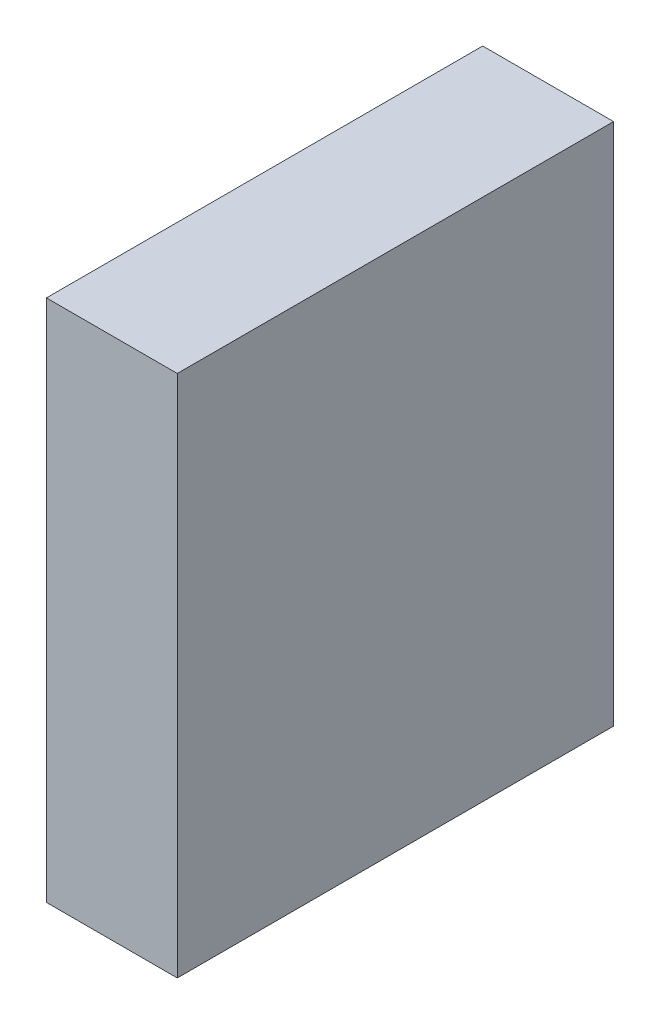
ISO-10303-21;
HEADER;
FILE_DESCRIPTION(('STEP AP214'),'2;1');
FILE_NAME('part.step','',(''),(''),'','','');
FILE_SCHEMA(('AUTOMOTIVE_DESIGN { 1 0 10303 214 1 1 1 1 }'));
ENDSEC;
DATA;
#1=APPLICATION_CONTEXT('core data for automotive mechanical design processes');
#2=APPLICATION_PROTOCOL_DEFINITION('international standard','automotive_design',2000,#1);
#3=PRODUCT_CONTEXT('',#1,'mechanical');
#4=PRODUCT('Part','Part','',(#3));
#5=PRODUCT_RELATED_PRODUCT_CATEGORY('part','',(#4));
#6=PRODUCT_DEFINITION_FORMATION('','',#4);
#7=PRODUCT_DEFINITION_CONTEXT('part definition',#1,'design');
#8=PRODUCT_DEFINITION('design','',#6,#7);
#9=PRODUCT_DEFINITION_SHAPE('','',#8);
#10=(LENGTH_UNIT() NAMED_UNIT(*) SI_UNIT(.MILLI.,.METRE.));
#11=(NAMED_UNIT(*) PLANE_ANGLE_UNIT() SI_UNIT($,.RADIAN.));
#12=(NAMED_UNIT(*) SI_UNIT($,.STERADIAN.) SOLID_ANGLE_UNIT());
#13=UNCERTAINTY_MEASURE_WITH_UNIT(LENGTH_MEASURE(1.E-05),#10,'distance_accuracy_value','');
#14=(GEOMETRIC_REPRESENTATION_CONTEXT(3) GLOBAL_UNCERTAINTY_ASSIGNED_CONTEXT((#13)) GLOBAL_UNIT_ASSIGNED_CONTEXT((#10,
#11,#12)) REPRESENTATION_CONTEXT('',''));
#15=CARTESIAN_POINT('',(0.,0.,0.));
#16=DIRECTION('',(0.,0.,1.));
#17=DIRECTION('',(1.,0.,0.));
#18=AXIS2_PLACEMENT_3D('',#15,#16,#17);
#19=CARTESIAN_POINT('',(1.72784810126582,-8.13607594936708,10.));
#20=DIRECTION('',(-1.,0.,0.));
#21=DIRECTION('',(0.,0.,1.));
#22=AXIS2_PLACEMENT_3D('',#19,#20,#21);
#23=PLANE('',#22);
#24=DIRECTION('',(0.,1.,0.));
#25=VECTOR('',#24,1.);
#26=CARTESIAN_POINT('',(1.72784810126582,-8.13607594936708,0.));
#27=LINE('',#26,#25);
#28=CARTESIAN_POINT('',(1.72784810126582,-8.13607594936708,0.));
#29=VERTEX_POINT('',#28);
#30=CARTESIAN_POINT('',(1.72784810126582,3.86392405063291,0.));
#31=VERTEX_POINT('',#30);
#32=EDGE_CURVE('E113',#29,#31,#27,.T.);
#33=ORIENTED_EDGE('',*,*,#32,.T.);
#34=DIRECTION('',(0.,0.,-1.));
#35=VECTOR('',#34,1.);
#36=CARTESIAN_POINT('',(1.72784810126582,3.86392405063291,10.));
#37=LINE('',#36,#35);
#38=CARTESIAN_POINT('',(1.72784810126582,3.86392405063291,10.));
#39=VERTEX_POINT('',#38);
#40=EDGE_CURVE('E11',#39,#31,#37,.T.);
#41=ORIENTED_EDGE('',*,*,#40,.F.);
#42=DIRECTION('',(0.,1.,0.));
#43=VECTOR('',#42,1.);
#44=CARTESIAN_POINT('',(1.72784810126582,-8.13607594936708,10.));
#45=LINE('',#44,#43);
#46=CARTESIAN_POINT('',(1.72784810126582,-8.13607594936708,10.));
#47=VERTEX_POINT('',#46);
#48=EDGE_CURVE('E97',#47,#39,#45,.T.);
#49=ORIENTED_EDGE('',*,*,#48,.F.);
#50=DIRECTION('',(0.,0.,-1.));
#51=VECTOR('',#50,1.);
#52=CARTESIAN_POINT('',(1.72784810126582,-8.13607594936708,10.));
#53=LINE('',#52,#51);
#54=EDGE_CURVE('E109',#47,#29,#53,.T.);
#55=ORIENTED_EDGE('',*,*,#54,.T.);
#56=EDGE_LOOP('',(#33,#41,#49,#55));
#57=FACE_BOUND('',#56,.T.);
#58=ADVANCED_FACE('F45',(#57),#23,.F.);
#59=CARTESIAN_POINT('',(-1.27215189873418,3.86392405063291,10.));
#60=DIRECTION('',(0.,-1.,0.));
#61=DIRECTION('',(0.,0.,-1.));
#62=AXIS2_PLACEMENT_3D('',#59,#60,#61);
#63=PLANE('',#62);
#64=DIRECTION('',(-1.,0.,0.));
#65=VECTOR('',#64,1.);
#66=CARTESIAN_POINT('',(-1.27215189873418,3.86392405063291,0.));
#67=LINE('',#66,#65);
#68=CARTESIAN_POINT('',(-1.27215189873418,3.86392405063291,0.));
#69=VERTEX_POINT('',#68);
#70=EDGE_CURVE('E102',#31,#69,#67,.T.);
#71=ORIENTED_EDGE('',*,*,#70,.T.);
#72=DIRECTION('',(0.,0.,-1.));
#73=VECTOR('',#72,1.);
#74=CARTESIAN_POINT('',(-1.27215189873418,3.86392405063291,10.));
#75=LINE('',#74,#73);
#76=CARTESIAN_POINT('',(-1.27215189873418,3.86392405063291,10.));
#77=VERTEX_POINT('',#76);
#78=EDGE_CURVE('E54',#77,#69,#75,.T.);
#79=ORIENTED_EDGE('',*,*,#78,.F.);
#80=DIRECTION('',(-1.,0.,0.));
#81=VECTOR('',#80,1.);
#82=CARTESIAN_POINT('',(-1.27215189873418,3.86392405063291,10.));
#83=LINE('',#82,#81);
#84=EDGE_CURVE('E92',#39,#77,#83,.T.);
#85=ORIENTED_EDGE('',*,*,#84,.F.);
#86=ORIENTED_EDGE('',*,*,#40,.T.);
#87=EDGE_LOOP('',(#71,#79,#85,#86));
#88=FACE_BOUND('',#87,.T.);
#89=ADVANCED_FACE('F101',(#88),#63,.F.);
#90=CARTESIAN_POINT('',(-1.27215189873418,-8.13607594936708,10.));
#91=DIRECTION('',(1.,0.,0.));
#92=DIRECTION('',(0.,0.,-1.));
#93=AXIS2_PLACEMENT_3D('',#90,#91,#92);
#94=PLANE('',#93);
#95=DIRECTION('',(0.,-1.,0.));
#96=VECTOR('',#95,1.);
#97=CARTESIAN_POINT('',(-1.27215189873418,-8.13607594936708,0.));
#98=LINE('',#97,#96);
#99=CARTESIAN_POINT('',(-1.27215189873418,-8.13607594936708,0.));
#100=VERTEX_POINT('',#99);
#101=EDGE_CURVE('E79',#69,#100,#98,.T.);
#102=ORIENTED_EDGE('',*,*,#101,.T.);
#103=DIRECTION('',(0.,0.,-1.));
#104=VECTOR('',#103,1.);
#105=CARTESIAN_POINT('',(-1.27215189873418,-8.13607594936708,10.));
#106=LINE('',#105,#104);
#107=CARTESIAN_POINT('',(-1.27215189873418,-8.13607594936708,10.));
#108=VERTEX_POINT('',#107);
#109=EDGE_CURVE('E104',#108,#100,#106,.T.);
#110=ORIENTED_EDGE('',*,*,#109,.F.);
#111=DIRECTION('',(0.,-1.,0.));
#112=VECTOR('',#111,1.);
#113=CARTESIAN_POINT('',(-1.27215189873418,-8.13607594936708,10.));
#114=LINE('',#113,#112);
#115=EDGE_CURVE('E95',#77,#108,#114,.T.);
#116=ORIENTED_EDGE('',*,*,#115,.F.);
#117=ORIENTED_EDGE('',*,*,#78,.T.);
#118=EDGE_LOOP('',(#102,#110,#116,#117));
#119=FACE_BOUND('',#118,.T.);
#120=ADVANCED_FACE('F105',(#119),#94,.F.);
#121=CARTESIAN_POINT('',(-1.27215189873418,-8.13607594936708,10.));
#122=DIRECTION('',(0.,1.,0.));
#123=DIRECTION('',(0.,0.,1.));
#124=AXIS2_PLACEMENT_3D('',#121,#122,#123);
#125=PLANE('',#124);
#126=DIRECTION('',(1.,0.,0.));
#127=VECTOR('',#126,1.);
#128=CARTESIAN_POINT('',(-1.27215189873418,-8.13607594936708,0.));
#129=LINE('',#128,#127);
#130=EDGE_CURVE('E85',#100,#29,#129,.T.);
#131=ORIENTED_EDGE('',*,*,#130,.T.);
#132=ORIENTED_EDGE('',*,*,#54,.F.);
#133=DIRECTION('',(1.,0.,0.));
#134=VECTOR('',#133,1.);
#135=CARTESIAN_POINT('',(-1.27215189873418,-8.13607594936708,10.));
#136=LINE('',#135,#134);
#137=EDGE_CURVE('E62',#108,#47,#136,.T.);
#138=ORIENTED_EDGE('',*,*,#137,.F.);
#139=ORIENTED_EDGE('',*,*,#109,.T.);
#140=EDGE_LOOP('',(#131,#132,#138,#139));
#141=FACE_BOUND('',#140,.T.);
#142=ADVANCED_FACE('F126',(#141),#125,.F.);
#143=CARTESIAN_POINT('',(0.,0.,10.));
#144=DIRECTION('',(0.,0.,-1.));
#145=DIRECTION('',(-1.,0.,0.));
#146=AXIS2_PLACEMENT_3D('',#143,#144,#145);
#147=PLANE('',#146);
#148=ORIENTED_EDGE('',*,*,#48,.T.);
#149=ORIENTED_EDGE('',*,*,#84,.T.);
#150=ORIENTED_EDGE('',*,*,#115,.T.);
#151=ORIENTED_EDGE('',*,*,#137,.T.);
#152=EDGE_LOOP('',(#148,#149,#150,#151));
#153=FACE_BOUND('',#152,.T.);
#154=ADVANCED_FACE('F93',(#153),#147,.F.);
#155=CARTESIAN_POINT('',(0.,0.,0.));
#156=DIRECTION('',(0.,0.,-1.));
#157=DIRECTION('',(-1.,0.,0.));
#158=AXIS2_PLACEMENT_3D('',#155,#156,#157);
#159=PLANE('',#158);
#160=ORIENTED_EDGE('',*,*,#32,.F.);
#161=ORIENTED_EDGE('',*,*,#130,.F.);
#162=ORIENTED_EDGE('',*,*,#101,.F.);
#163=ORIENTED_EDGE('',*,*,#70,.F.);
#164=EDGE_LOOP('',(#160,#161,#162,#163));
#165=FACE_BOUND('',#164,.T.);
#166=ADVANCED_FACE('F129',(#165),#159,.T.);
#167=CLOSED_SHELL('',(#58,#89,#120,#142,#154,#166));
#168=MANIFOLD_SOLID_BREP('B2',#167);
#169=ADVANCED_BREP_SHAPE_REPRESENTATION('',(#18,#168),#14);
#170=SHAPE_DEFINITION_REPRESENTATION(#9,#169);
ENDSEC;
END-ISO-10303-21;
